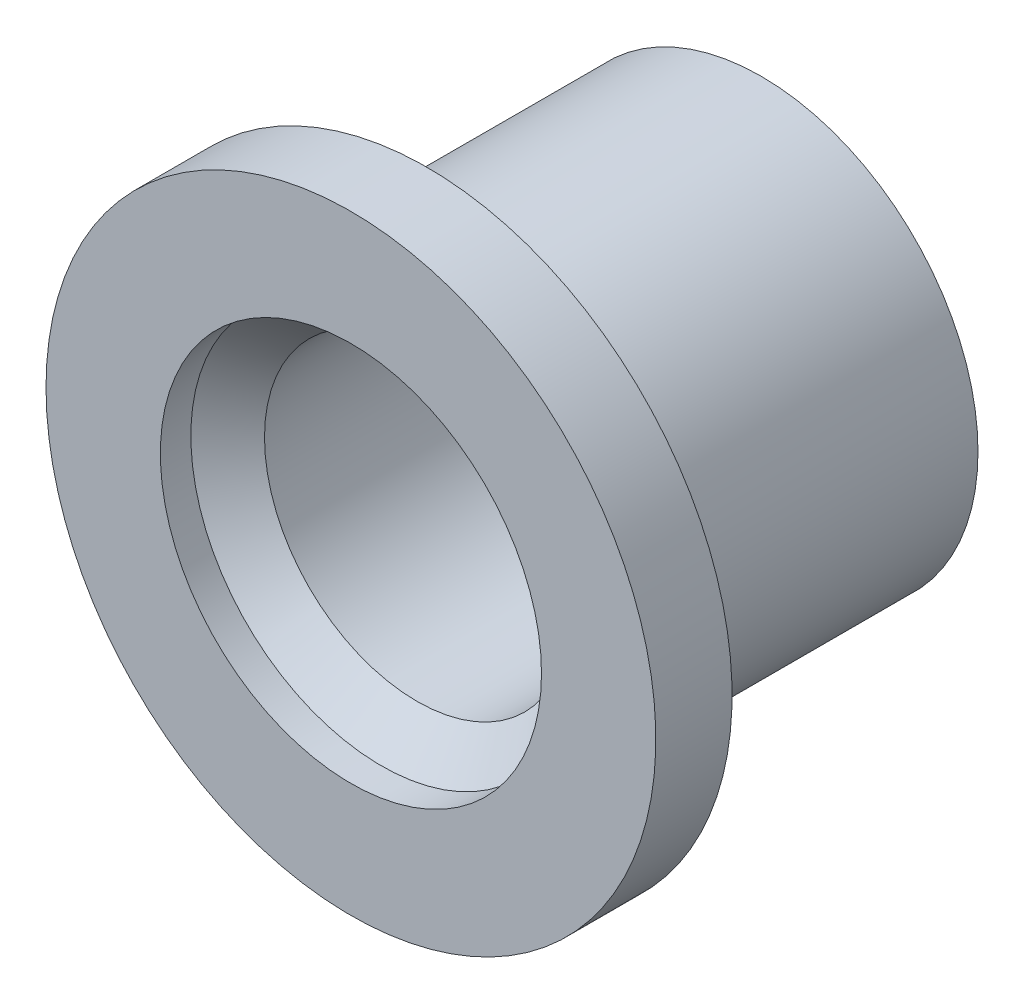
ISO-10303-21;
HEADER;
FILE_DESCRIPTION(('STEP AP214'),'2;1');
FILE_NAME('part.step','',(''),(''),'','','');
FILE_SCHEMA(('AUTOMOTIVE_DESIGN { 1 0 10303 214 1 1 1 1 }'));
ENDSEC;
DATA;
#1=APPLICATION_CONTEXT('core data for automotive mechanical design processes');
#2=APPLICATION_PROTOCOL_DEFINITION('international standard','automotive_design',2000,#1);
#3=PRODUCT_CONTEXT('',#1,'mechanical');
#4=PRODUCT('Part','Part','',(#3));
#5=PRODUCT_RELATED_PRODUCT_CATEGORY('part','',(#4));
#6=PRODUCT_DEFINITION_FORMATION('','',#4);
#7=PRODUCT_DEFINITION_CONTEXT('part definition',#1,'design');
#8=PRODUCT_DEFINITION('design','',#6,#7);
#9=PRODUCT_DEFINITION_SHAPE('','',#8);
#10=(LENGTH_UNIT() NAMED_UNIT(*) SI_UNIT(.MILLI.,.METRE.));
#11=(NAMED_UNIT(*) PLANE_ANGLE_UNIT() SI_UNIT($,.RADIAN.));
#12=(NAMED_UNIT(*) SI_UNIT($,.STERADIAN.) SOLID_ANGLE_UNIT());
#13=UNCERTAINTY_MEASURE_WITH_UNIT(LENGTH_MEASURE(1.E-05),#10,'distance_accuracy_value','');
#14=(GEOMETRIC_REPRESENTATION_CONTEXT(3) GLOBAL_UNCERTAINTY_ASSIGNED_CONTEXT((#13)) GLOBAL_UNIT_ASSIGNED_CONTEXT((#10,
#11,#12)) REPRESENTATION_CONTEXT('',''));
#15=CARTESIAN_POINT('',(0.,0.,0.));
#16=DIRECTION('',(0.,0.,1.));
#17=DIRECTION('',(1.,0.,0.));
#18=AXIS2_PLACEMENT_3D('',#15,#16,#17);
#19=CARTESIAN_POINT('',(0.,0.,0.));
#20=DIRECTION('',(0.,0.,1.));
#21=DIRECTION('',(1.,0.,0.));
#22=AXIS2_PLACEMENT_3D('',#19,#20,#21);
#23=PLANE('',#22);
#24=CARTESIAN_POINT('',(0.,0.,0.));
#25=DIRECTION('',(0.,0.,1.));
#26=DIRECTION('',(1.,0.,0.));
#27=AXIS2_PLACEMENT_3D('',#24,#25,#26);
#28=CIRCLE('',#27,5.08);
#29=CARTESIAN_POINT('',(-5.08,0.,0.));
#30=VERTEX_POINT('',#29);
#31=EDGE_CURVE('E48',#30,#30,#28,.T.);
#32=ORIENTED_EDGE('',*,*,#31,.F.);
#33=EDGE_LOOP('',(#32));
#34=FACE_BOUND('',#33,.T.);
#35=CARTESIAN_POINT('',(0.,0.,0.));
#36=DIRECTION('',(0.,0.,1.));
#37=DIRECTION('',(1.,0.,0.));
#38=AXIS2_PLACEMENT_3D('',#35,#36,#37);
#39=CIRCLE('',#38,3.60939766381894);
#40=CARTESIAN_POINT('',(3.60939766381894,0.,0.));
#41=VERTEX_POINT('',#40);
#42=EDGE_CURVE('E11',#41,#41,#39,.F.);
#43=ORIENTED_EDGE('',*,*,#42,.F.);
#44=EDGE_LOOP('',(#43));
#45=FACE_BOUND('',#44,.T.);
#46=ADVANCED_FACE('F33',(#34,#45),#23,.F.);
#47=CARTESIAN_POINT('',(0.,0.,0.762));
#48=DIRECTION('',(0.,0.,-1.));
#49=DIRECTION('',(-1.,0.,0.));
#50=AXIS2_PLACEMENT_3D('',#47,#48,#49);
#51=CYLINDRICAL_SURFACE('',#50,5.08);
#52=CARTESIAN_POINT('',(0.,0.,1.27));
#53=DIRECTION('',(0.,0.,1.));
#54=DIRECTION('',(1.,0.,0.));
#55=AXIS2_PLACEMENT_3D('',#52,#53,#54);
#56=CIRCLE('',#55,5.08);
#57=CARTESIAN_POINT('',(-5.08,0.,1.27));
#58=VERTEX_POINT('',#57);
#59=EDGE_CURVE('E53',#58,#58,#56,.T.);
#60=CARTESIAN_POINT('',(-5.08,0.,0.));
#61=CARTESIAN_POINT('',(-5.08,0.,0.0132291666666667));
#62=CARTESIAN_POINT('',(-5.08,0.,0.0264583333333333));
#63=CARTESIAN_POINT('',(-5.08,0.,0.0529166666666667));
#64=CARTESIAN_POINT('',(-5.08,0.,0.0661458333333333));
#65=CARTESIAN_POINT('',(-5.08,0.,0.0926041666666667));
#66=CARTESIAN_POINT('',(-5.08,0.,0.105833333333333));
#67=CARTESIAN_POINT('',(-5.08,0.,0.132291666666667));
#68=CARTESIAN_POINT('',(-5.08,0.,0.145520833333333));
#69=CARTESIAN_POINT('',(-5.08,0.,0.171979166666667));
#70=CARTESIAN_POINT('',(-5.08,0.,0.185208333333333));
#71=CARTESIAN_POINT('',(-5.08,0.,0.211666666666667));
#72=CARTESIAN_POINT('',(-5.08,0.,0.224895833333333));
#73=CARTESIAN_POINT('',(-5.08,0.,0.251354166666667));
#74=CARTESIAN_POINT('',(-5.08,0.,0.264583333333333));
#75=CARTESIAN_POINT('',(-5.08,0.,0.291041666666667));
#76=CARTESIAN_POINT('',(-5.08,0.,0.304270833333333));
#77=CARTESIAN_POINT('',(-5.08,0.,0.330729166666667));
#78=CARTESIAN_POINT('',(-5.08,0.,0.343958333333333));
#79=CARTESIAN_POINT('',(-5.08,0.,0.370416666666667));
#80=CARTESIAN_POINT('',(-5.08,0.,0.383645833333333));
#81=CARTESIAN_POINT('',(-5.08,0.,0.410104166666667));
#82=CARTESIAN_POINT('',(-5.08,0.,0.423333333333333));
#83=CARTESIAN_POINT('',(-5.08,0.,0.449791666666667));
#84=CARTESIAN_POINT('',(-5.08,0.,0.463020833333333));
#85=CARTESIAN_POINT('',(-5.08,0.,0.489479166666667));
#86=CARTESIAN_POINT('',(-5.08,0.,0.502708333333333));
#87=CARTESIAN_POINT('',(-5.08,0.,0.529166666666666));
#88=CARTESIAN_POINT('',(-5.08,0.,0.542395833333333));
#89=CARTESIAN_POINT('',(-5.08,0.,0.568854166666667));
#90=CARTESIAN_POINT('',(-5.08,0.,0.582083333333333));
#91=CARTESIAN_POINT('',(-5.08,0.,0.608541666666667));
#92=CARTESIAN_POINT('',(-5.08,0.,0.621770833333333));
#93=CARTESIAN_POINT('',(-5.08,0.,0.648229166666667));
#94=CARTESIAN_POINT('',(-5.08,0.,0.661458333333333));
#95=CARTESIAN_POINT('',(-5.08,0.,0.687916666666667));
#96=CARTESIAN_POINT('',(-5.08,0.,0.701145833333333));
#97=CARTESIAN_POINT('',(-5.08,0.,0.727604166666666));
#98=CARTESIAN_POINT('',(-5.08,0.,0.740833333333333));
#99=CARTESIAN_POINT('',(-5.08,0.,0.767291666666667));
#100=CARTESIAN_POINT('',(-5.08,0.,0.780520833333333));
#101=CARTESIAN_POINT('',(-5.08,0.,0.806979166666666));
#102=CARTESIAN_POINT('',(-5.08,0.,0.820208333333333));
#103=CARTESIAN_POINT('',(-5.08,0.,0.846666666666666));
#104=CARTESIAN_POINT('',(-5.08,0.,0.859895833333333));
#105=CARTESIAN_POINT('',(-5.08,0.,0.886354166666666));
#106=CARTESIAN_POINT('',(-5.08,0.,0.899583333333333));
#107=CARTESIAN_POINT('',(-5.08,0.,0.926041666666666));
#108=CARTESIAN_POINT('',(-5.08,0.,0.939270833333333));
#109=CARTESIAN_POINT('',(-5.08,0.,0.965729166666666));
#110=CARTESIAN_POINT('',(-5.08,0.,0.978958333333333));
#111=CARTESIAN_POINT('',(-5.08,0.,1.00541666666667));
#112=CARTESIAN_POINT('',(-5.08,0.,1.01864583333333));
#113=CARTESIAN_POINT('',(-5.08,0.,1.04510416666667));
#114=CARTESIAN_POINT('',(-5.08,0.,1.05833333333333));
#115=CARTESIAN_POINT('',(-5.08,0.,1.08479166666667));
#116=CARTESIAN_POINT('',(-5.08,0.,1.09802083333333));
#117=CARTESIAN_POINT('',(-5.08,0.,1.12447916666667));
#118=CARTESIAN_POINT('',(-5.08,0.,1.13770833333333));
#119=CARTESIAN_POINT('',(-5.08,0.,1.16416666666667));
#120=CARTESIAN_POINT('',(-5.08,0.,1.17739583333333));
#121=CARTESIAN_POINT('',(-5.08,0.,1.20385416666667));
#122=CARTESIAN_POINT('',(-5.08,0.,1.21708333333333));
#123=CARTESIAN_POINT('',(-5.08,0.,1.24354166666667));
#124=CARTESIAN_POINT('',(-5.08,0.,1.25677083333333));
#125=CARTESIAN_POINT('',(-5.08,0.,1.27));
#126=B_SPLINE_CURVE_WITH_KNOTS('',3,(#60,#61,#62,#63,#64,#65,#66,#67,#68,#69,#70,#71,#72,#73,
#74,#75,#76,#77,#78,#79,#80,#81,#82,#83,#84,#85,#86,#87,#88,#89,#90,#91,#92,#93,#94,#95,#96,#97,
#98,#99,#100,#101,#102,#103,#104,#105,#106,#107,#108,#109,#110,#111,#112,#113,#114,#115,#116,
#117,#118,#119,#120,#121,#122,#123,#124,#125),.UNSPECIFIED.,.F.,.F.,(4,2,2,2,2,2,2,2,2,2,2,2,2,
2,2,2,2,2,2,2,2,2,2,2,2,2,2,2,2,2,2,2,4),(0.,0.0396875,0.079375,0.1190625,0.15875,0.1984375,
0.238125,0.2778125,0.3175,0.3571875,0.396875,0.4365625,0.47625,0.5159375,0.555625,0.5953125,
0.635,0.6746875,0.714375,0.7540625,0.79375,0.8334375,0.873125,0.9128125,0.9525,0.9921875,
1.031875,1.0715625,1.11125,1.1509375,1.190625,1.2303125,1.27),.UNSPECIFIED.);
#127=EDGE_CURVE('BSEAM79',#30,#58,#126,.T.);
#128=ORIENTED_EDGE('',*,*,#31,.T.);
#129=ORIENTED_EDGE('',*,*,#59,.F.);
#130=ORIENTED_EDGE('',*,*,#127,.T.);
#131=ORIENTED_EDGE('',*,*,#127,.F.);
#132=EDGE_LOOP('',(#128,#130,#129,#131));
#133=FACE_BOUND('',#132,.T.);
#134=ADVANCED_FACE('F79',(#133),#51,.T.);
#135=CARTESIAN_POINT('',(0.,0.,0.762));
#136=DIRECTION('',(0.,0.,-1.));
#137=DIRECTION('',(-1.,0.,0.));
#138=AXIS2_PLACEMENT_3D('',#135,#136,#137);
#139=CYLINDRICAL_SURFACE('',#138,2.54);
#140=CARTESIAN_POINT('',(0.,0.,0.169852920302577));
#141=DIRECTION('',(0.,0.,1.));
#142=DIRECTION('',(1.,0.,0.));
#143=AXIS2_PLACEMENT_3D('',#140,#141,#142);
#144=CIRCLE('',#143,2.54);
#145=CARTESIAN_POINT('',(-2.54,0.,0.169852920302577));
#146=VERTEX_POINT('',#145);
#147=EDGE_CURVE('E44',#146,#146,#144,.T.);
#148=CARTESIAN_POINT('',(0.,0.,-5.56768000000001));
#149=DIRECTION('',(0.,0.,1.));
#150=DIRECTION('',(0.,-1.,0.));
#151=AXIS2_PLACEMENT_3D('',#148,#149,#150);
#152=CIRCLE('',#151,2.54);
#153=CARTESIAN_POINT('',(-2.54,0.,-5.56768000000001));
#154=VERTEX_POINT('',#153);
#155=EDGE_CURVE('E59',#154,#154,#152,.T.);
#156=CARTESIAN_POINT('',(-2.54,0.,0.169852920302577));
#157=CARTESIAN_POINT('',(-2.54,0.,0.110086952382759));
#158=CARTESIAN_POINT('',(-2.54,0.,0.0503209844629401));
#159=CARTESIAN_POINT('',(-2.54,0.,-0.0692109513766971));
#160=CARTESIAN_POINT('',(-2.54,0.,-0.128976919296516));
#161=CARTESIAN_POINT('',(-2.54,0.,-0.248508855136153));
#162=CARTESIAN_POINT('',(-2.54,0.,-0.308274823055971));
#163=CARTESIAN_POINT('',(-2.54,0.,-0.427806758895608));
#164=CARTESIAN_POINT('',(-2.54,0.,-0.487572726815427));
#165=CARTESIAN_POINT('',(-2.54,0.,-0.607104662655064));
#166=CARTESIAN_POINT('',(-2.54,0.,-0.666870630574883));
#167=CARTESIAN_POINT('',(-2.54,0.,-0.78640256641452));
#168=CARTESIAN_POINT('',(-2.54,0.,-0.846168534334338));
#169=CARTESIAN_POINT('',(-2.54,0.,-0.965700470173976));
#170=CARTESIAN_POINT('',(-2.54,0.,-1.02546643809379));
#171=CARTESIAN_POINT('',(-2.54,0.,-1.14499837393343));
#172=CARTESIAN_POINT('',(-2.54,0.,-1.20476434185325));
#173=CARTESIAN_POINT('',(-2.54,0.,-1.32429627769289));
#174=CARTESIAN_POINT('',(-2.54,0.,-1.3840622456127));
#175=CARTESIAN_POINT('',(-2.54,0.,-1.50359418145234));
#176=CARTESIAN_POINT('',(-2.54,0.,-1.56336014937216));
#177=CARTESIAN_POINT('',(-2.54,0.,-1.6828920852118));
#178=CARTESIAN_POINT('',(-2.54,0.,-1.74265805313162));
#179=CARTESIAN_POINT('',(-2.54,0.,-1.86218998897125));
#180=CARTESIAN_POINT('',(-2.54,0.,-1.92195595689107));
#181=CARTESIAN_POINT('',(-2.54,0.,-2.04148789273071));
#182=CARTESIAN_POINT('',(-2.54,0.,-2.10125386065053));
#183=CARTESIAN_POINT('',(-2.54,0.,-2.22078579649017));
#184=CARTESIAN_POINT('',(-2.54,0.,-2.28055176440998));
#185=CARTESIAN_POINT('',(-2.54,0.,-2.40008370024962));
#186=CARTESIAN_POINT('',(-2.54,0.,-2.45984966816944));
#187=CARTESIAN_POINT('',(-2.54,0.,-2.57938160400908));
#188=CARTESIAN_POINT('',(-2.54,0.,-2.6391475719289));
#189=CARTESIAN_POINT('',(-2.54,0.,-2.75867950776853));
#190=CARTESIAN_POINT('',(-2.54,0.,-2.81844547568835));
#191=CARTESIAN_POINT('',(-2.54,0.,-2.93797741152799));
#192=CARTESIAN_POINT('',(-2.54,0.,-2.99774337944781));
#193=CARTESIAN_POINT('',(-2.54,0.,-3.11727531528744));
#194=CARTESIAN_POINT('',(-2.54,0.,-3.17704128320726));
#195=CARTESIAN_POINT('',(-2.54,0.,-3.2965732190469));
#196=CARTESIAN_POINT('',(-2.54,0.,-3.35633918696672));
#197=CARTESIAN_POINT('',(-2.54,0.,-3.47587112280635));
#198=CARTESIAN_POINT('',(-2.54,0.,-3.53563709072617));
#199=CARTESIAN_POINT('',(-2.54,0.,-3.65516902656581));
#200=CARTESIAN_POINT('',(-2.54,0.,-3.71493499448563));
#201=CARTESIAN_POINT('',(-2.54,0.,-3.83446693032527));
#202=CARTESIAN_POINT('',(-2.54,0.,-3.89423289824509));
#203=CARTESIAN_POINT('',(-2.54,0.,-4.01376483408472));
#204=CARTESIAN_POINT('',(-2.54,0.,-4.07353080200454));
#205=CARTESIAN_POINT('',(-2.54,0.,-4.19306273784418));
#206=CARTESIAN_POINT('',(-2.54,0.,-4.252828705764));
#207=CARTESIAN_POINT('',(-2.54,0.,-4.37236064160363));
#208=CARTESIAN_POINT('',(-2.54,0.,-4.43212660952345));
#209=CARTESIAN_POINT('',(-2.54,0.,-4.55165854536309));
#210=CARTESIAN_POINT('',(-2.54,0.,-4.61142451328291));
#211=CARTESIAN_POINT('',(-2.54,0.,-4.73095644912255));
#212=CARTESIAN_POINT('',(-2.54,0.,-4.79072241704236));
#213=CARTESIAN_POINT('',(-2.54,0.,-4.910254352882));
#214=CARTESIAN_POINT('',(-2.54,0.,-4.97002032080182));
#215=CARTESIAN_POINT('',(-2.54,0.,-5.08955225664146));
#216=CARTESIAN_POINT('',(-2.54,0.,-5.14931822456127));
#217=CARTESIAN_POINT('',(-2.54,0.,-5.26885016040091));
#218=CARTESIAN_POINT('',(-2.54,0.,-5.32861612832073));
#219=CARTESIAN_POINT('',(-2.54,0.,-5.44814806416037));
#220=CARTESIAN_POINT('',(-2.54,0.,-5.50791403208019));
#221=CARTESIAN_POINT('',(-2.54,0.,-5.56768000000001));
#222=B_SPLINE_CURVE_WITH_KNOTS('',3,(#156,#157,#158,#159,#160,#161,#162,#163,#164,#165,#166,
#167,#168,#169,#170,#171,#172,#173,#174,#175,#176,#177,#178,#179,#180,#181,#182,#183,#184,#185,
#186,#187,#188,#189,#190,#191,#192,#193,#194,#195,#196,#197,#198,#199,#200,#201,#202,#203,#204,
#205,#206,#207,#208,#209,#210,#211,#212,#213,#214,#215,#216,#217,#218,#219,#220,#221),
.UNSPECIFIED.,.F.,.F.,(4,2,2,2,2,2,2,2,2,2,2,2,2,2,2,2,2,2,2,2,2,2,2,2,2,2,2,2,2,2,2,2,4),(0.,
0.179297903759456,0.358595807518912,0.537893711278367,0.717191615037823,0.896489518797279,
1.07578742255673,1.25508532631619,1.43438323007565,1.6136811338351,1.79297903759456,
1.97227694135401,2.15157484511347,2.33087274887292,2.51017065263238,2.68946855639184,
2.86876646015129,3.04806436391075,3.2273622676702,3.40666017142966,3.58595807518911,
3.76525597894857,3.94455388270803,4.12385178646748,4.30314969022694,4.48244759398639,
4.66174549774585,4.8410434015053,5.02034130526476,5.19963920902422,5.37893711278367,
5.55823501654313,5.73753292030258),.UNSPECIFIED.);
#223=EDGE_CURVE('BSEAM87',#146,#154,#222,.T.);
#224=ORIENTED_EDGE('',*,*,#147,.T.);
#225=ORIENTED_EDGE('',*,*,#155,.F.);
#226=ORIENTED_EDGE('',*,*,#223,.T.);
#227=ORIENTED_EDGE('',*,*,#223,.F.);
#228=EDGE_LOOP('',(#224,#226,#225,#227));
#229=FACE_BOUND('',#228,.T.);
#230=ADVANCED_FACE('F87',(#229),#139,.F.);
#231=CARTESIAN_POINT('',(0.,0.,0.169852920302577));
#232=DIRECTION('',(0.,0.,1.));
#233=DIRECTION('',(1.,0.,0.));
#234=AXIS2_PLACEMENT_3D('',#231,#232,#233);
#235=CONICAL_SURFACE('',#234,2.54,0.820304748437337);
#236=CARTESIAN_POINT('',(0.,0.,0.762));
#237=DIRECTION('',(0.,0.,1.));
#238=DIRECTION('',(1.,0.,0.));
#239=AXIS2_PLACEMENT_3D('',#236,#237,#238);
#240=CIRCLE('',#239,3.17500000000001);
#241=CARTESIAN_POINT('',(3.17500000000001,0.,0.762));
#242=VERTEX_POINT('',#241);
#243=EDGE_CURVE('E40',#242,#242,#240,.F.);
#244=ORIENTED_EDGE('',*,*,#243,.F.);
#245=EDGE_LOOP('',(#244));
#246=FACE_BOUND('',#245,.T.);
#247=ORIENTED_EDGE('',*,*,#147,.F.);
#248=EDGE_LOOP('',(#247));
#249=FACE_BOUND('',#248,.T.);
#250=ADVANCED_FACE('F35',(#246,#249),#235,.F.);
#251=CARTESIAN_POINT('',(0.,0.,1.27));
#252=DIRECTION('',(0.,0.,1.));
#253=DIRECTION('',(1.,0.,0.));
#254=AXIS2_PLACEMENT_3D('',#251,#252,#253);
#255=PLANE('',#254);
#256=ORIENTED_EDGE('',*,*,#59,.T.);
#257=EDGE_LOOP('',(#256));
#258=FACE_BOUND('',#257,.T.);
#259=CARTESIAN_POINT('',(0.,0.,1.27));
#260=DIRECTION('',(0.,0.,1.));
#261=DIRECTION('',(1.,0.,0.));
#262=AXIS2_PLACEMENT_3D('',#259,#260,#261);
#263=CIRCLE('',#262,3.175);
#264=CARTESIAN_POINT('',(3.175,0.,1.27));
#265=VERTEX_POINT('',#264);
#266=EDGE_CURVE('E56',#265,#265,#263,.T.);
#267=ORIENTED_EDGE('',*,*,#266,.F.);
#268=EDGE_LOOP('',(#267));
#269=FACE_BOUND('',#268,.T.);
#270=ADVANCED_FACE('F95',(#258,#269),#255,.T.);
#271=CARTESIAN_POINT('',(0.,0.,1.27));
#272=DIRECTION('',(0.,0.,-1.));
#273=DIRECTION('',(-1.,0.,0.));
#274=AXIS2_PLACEMENT_3D('',#271,#272,#273);
#275=CYLINDRICAL_SURFACE('',#274,3.175);
#276=ORIENTED_EDGE('',*,*,#266,.T.);
#277=EDGE_LOOP('',(#276));
#278=FACE_BOUND('',#277,.T.);
#279=ORIENTED_EDGE('',*,*,#243,.T.);
#280=EDGE_LOOP('',(#279));
#281=FACE_BOUND('',#280,.T.);
#282=ADVANCED_FACE('F75',(#278,#281),#275,.F.);
#283=CARTESIAN_POINT('',(0.,0.,-15.801998256341));
#284=DIRECTION('',(0.,0.,1.));
#285=DIRECTION('',(1.,0.,0.));
#286=AXIS2_PLACEMENT_3D('',#283,#284,#285);
#287=CYLINDRICAL_SURFACE('',#286,3.60939766381894);
#288=CARTESIAN_POINT('',(0.,0.,-5.56768000000001));
#289=DIRECTION('',(0.,0.,1.));
#290=DIRECTION('',(0.,-1.,0.));
#291=AXIS2_PLACEMENT_3D('',#288,#289,#290);
#292=CIRCLE('',#291,3.60939766381894);
#293=CARTESIAN_POINT('',(0.,-3.60939766381894,-5.56768));
#294=VERTEX_POINT('',#293);
#295=EDGE_CURVE('E62',#294,#294,#292,.T.);
#296=ORIENTED_EDGE('',*,*,#295,.T.);
#297=EDGE_LOOP('',(#296));
#298=FACE_BOUND('',#297,.T.);
#299=ORIENTED_EDGE('',*,*,#42,.T.);
#300=EDGE_LOOP('',(#299));
#301=FACE_BOUND('',#300,.T.);
#302=ADVANCED_FACE('F66',(#298,#301),#287,.T.);
#303=CARTESIAN_POINT('',(0.,0.,-5.56768));
#304=DIRECTION('',(0.,0.,1.));
#305=DIRECTION('',(0.200291576214415,0.979736334172386,0.));
#306=AXIS2_PLACEMENT_3D('',#303,#304,#305);
#307=PLANE('',#306);
#308=ORIENTED_EDGE('',*,*,#155,.T.);
#309=EDGE_LOOP('',(#308));
#310=FACE_BOUND('',#309,.T.);
#311=ORIENTED_EDGE('',*,*,#295,.F.);
#312=EDGE_LOOP('',(#311));
#313=FACE_BOUND('',#312,.T.);
#314=ADVANCED_FACE('F68',(#310,#313),#307,.F.);
#315=CLOSED_SHELL('',(#46,#134,#230,#250,#270,#282,#302,#314));
#316=MANIFOLD_SOLID_BREP('B2',#315);
#317=ADVANCED_BREP_SHAPE_REPRESENTATION('',(#18,#316),#14);
#318=SHAPE_DEFINITION_REPRESENTATION(#9,#317);
ENDSEC;
END-ISO-10303-21;
